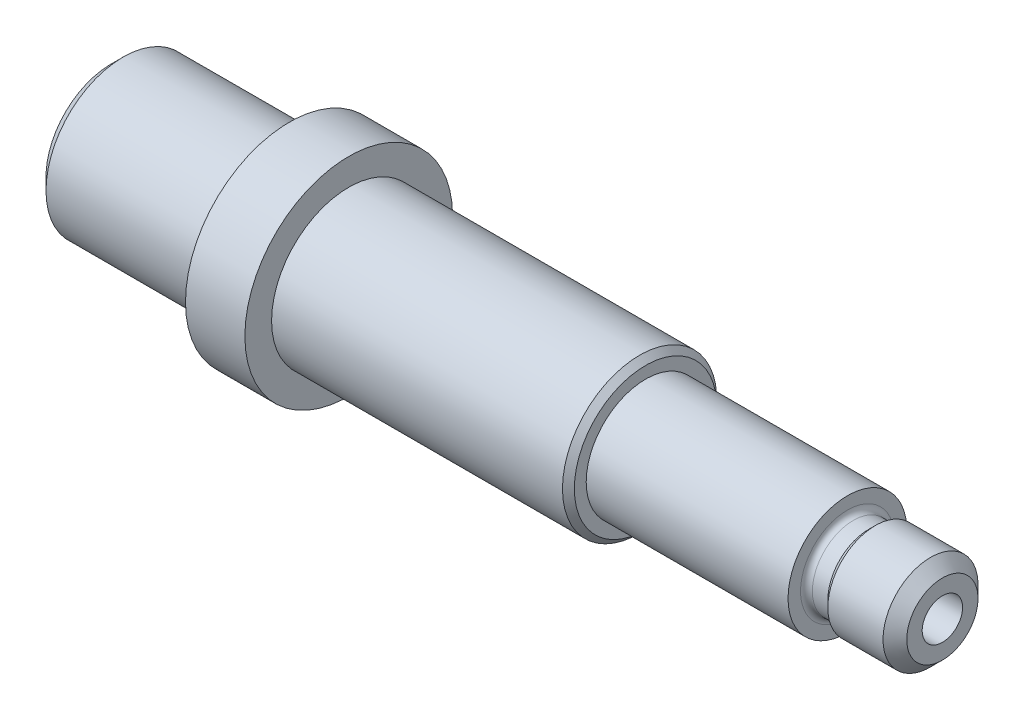
ISO-10303-21;
HEADER;
FILE_DESCRIPTION(('STEP AP214'),'2;1');
FILE_NAME('part.step','',(''),(''),'','','');
FILE_SCHEMA(('AUTOMOTIVE_DESIGN { 1 0 10303 214 1 1 1 1 }'));
ENDSEC;
DATA;
#1=APPLICATION_CONTEXT('core data for automotive mechanical design processes');
#2=APPLICATION_PROTOCOL_DEFINITION('international standard','automotive_design',2000,#1);
#3=PRODUCT_CONTEXT('',#1,'mechanical');
#4=PRODUCT('Part','Part','',(#3));
#5=PRODUCT_RELATED_PRODUCT_CATEGORY('part','',(#4));
#6=PRODUCT_DEFINITION_FORMATION('','',#4);
#7=PRODUCT_DEFINITION_CONTEXT('part definition',#1,'design');
#8=PRODUCT_DEFINITION('design','',#6,#7);
#9=PRODUCT_DEFINITION_SHAPE('','',#8);
#10=(LENGTH_UNIT() NAMED_UNIT(*) SI_UNIT(.MILLI.,.METRE.));
#11=(NAMED_UNIT(*) PLANE_ANGLE_UNIT() SI_UNIT($,.RADIAN.));
#12=(NAMED_UNIT(*) SI_UNIT($,.STERADIAN.) SOLID_ANGLE_UNIT());
#13=UNCERTAINTY_MEASURE_WITH_UNIT(LENGTH_MEASURE(1.E-05),#10,'distance_accuracy_value','');
#14=(GEOMETRIC_REPRESENTATION_CONTEXT(3) GLOBAL_UNCERTAINTY_ASSIGNED_CONTEXT((#13)) GLOBAL_UNIT_ASSIGNED_CONTEXT((#10,
#11,#12)) REPRESENTATION_CONTEXT('',''));
#15=CARTESIAN_POINT('',(0.,0.,0.));
#16=DIRECTION('',(0.,0.,1.));
#17=DIRECTION('',(1.,0.,0.));
#18=AXIS2_PLACEMENT_3D('',#15,#16,#17);
#19=CARTESIAN_POINT('',(0.,0.,0.));
#20=DIRECTION('',(1.,0.,0.));
#21=DIRECTION('',(0.,0.,-1.));
#22=AXIS2_PLACEMENT_3D('',#19,#20,#21);
#23=PLANE('',#22);
#24=CARTESIAN_POINT('',(0.,0.,0.));
#25=DIRECTION('',(1.,0.,0.));
#26=DIRECTION('',(0.,0.,-1.));
#27=AXIS2_PLACEMENT_3D('',#24,#25,#26);
#28=CIRCLE('',#27,11.);
#29=CARTESIAN_POINT('',(0.,0.,-11.));
#30=VERTEX_POINT('',#29);
#31=EDGE_CURVE('E111',#30,#30,#28,.F.);
#32=ORIENTED_EDGE('',*,*,#31,.T.);
#33=EDGE_LOOP('',(#32));
#34=FACE_BOUND('',#33,.T.);
#35=CARTESIAN_POINT('',(0.,0.,0.));
#36=DIRECTION('',(-1.,0.,0.));
#37=DIRECTION('',(0.,0.,1.));
#38=AXIS2_PLACEMENT_3D('',#35,#36,#37);
#39=CIRCLE('',#38,5.5);
#40=CARTESIAN_POINT('',(0.,0.,5.5));
#41=VERTEX_POINT('',#40);
#42=EDGE_CURVE('E79',#41,#41,#39,.T.);
#43=ORIENTED_EDGE('',*,*,#42,.F.);
#44=EDGE_LOOP('',(#43));
#45=FACE_BOUND('',#44,.T.);
#46=ADVANCED_FACE('F55',(#34,#45),#23,.F.);
#47=CARTESIAN_POINT('',(-123.335902370818,0.,0.));
#48=DIRECTION('',(-1.,0.,0.));
#49=DIRECTION('',(0.,0.,1.));
#50=AXIS2_PLACEMENT_3D('',#47,#48,#49);
#51=CYLINDRICAL_SURFACE('',#50,13.);
#52=CARTESIAN_POINT('',(2.,0.,0.));
#53=DIRECTION('',(1.,0.,0.));
#54=DIRECTION('',(0.,0.,-1.));
#55=AXIS2_PLACEMENT_3D('',#52,#53,#54);
#56=CIRCLE('',#55,13.);
#57=CARTESIAN_POINT('',(2.,0.,-13.));
#58=VERTEX_POINT('',#57);
#59=EDGE_CURVE('E114',#58,#58,#56,.T.);
#60=ORIENTED_EDGE('',*,*,#59,.T.);
#61=EDGE_LOOP('',(#60));
#62=FACE_BOUND('',#61,.T.);
#63=CARTESIAN_POINT('',(30.,0.,0.));
#64=DIRECTION('',(-1.,0.,0.));
#65=DIRECTION('',(0.,0.,1.));
#66=AXIS2_PLACEMENT_3D('',#63,#64,#65);
#67=CIRCLE('',#66,13.);
#68=CARTESIAN_POINT('',(30.,0.,13.));
#69=VERTEX_POINT('',#68);
#70=EDGE_CURVE('E108',#69,#69,#67,.T.);
#71=ORIENTED_EDGE('',*,*,#70,.T.);
#72=EDGE_LOOP('',(#71));
#73=FACE_BOUND('',#72,.T.);
#74=ADVANCED_FACE('F151',(#62,#73),#51,.T.);
#75=CARTESIAN_POINT('',(30.,13.,0.));
#76=DIRECTION('',(1.,0.,0.));
#77=DIRECTION('',(0.,0.,-1.));
#78=AXIS2_PLACEMENT_3D('',#75,#76,#77);
#79=PLANE('',#78);
#80=ORIENTED_EDGE('',*,*,#70,.F.);
#81=EDGE_LOOP('',(#80));
#82=FACE_BOUND('',#81,.T.);
#83=CARTESIAN_POINT('',(30.,0.,0.));
#84=DIRECTION('',(-1.,0.,0.));
#85=DIRECTION('',(0.,0.,1.));
#86=AXIS2_PLACEMENT_3D('',#83,#84,#85);
#87=CIRCLE('',#86,17.5);
#88=CARTESIAN_POINT('',(30.,0.,17.5));
#89=VERTEX_POINT('',#88);
#90=EDGE_CURVE('E105',#89,#89,#87,.T.);
#91=ORIENTED_EDGE('',*,*,#90,.T.);
#92=EDGE_LOOP('',(#91));
#93=FACE_BOUND('',#92,.T.);
#94=ADVANCED_FACE('F158',(#82,#93),#79,.F.);
#95=CARTESIAN_POINT('',(-123.335902370818,0.,0.));
#96=DIRECTION('',(-1.,0.,0.));
#97=DIRECTION('',(0.,0.,1.));
#98=AXIS2_PLACEMENT_3D('',#95,#96,#97);
#99=CYLINDRICAL_SURFACE('',#98,17.5);
#100=ORIENTED_EDGE('',*,*,#90,.F.);
#101=EDGE_LOOP('',(#100));
#102=FACE_BOUND('',#101,.T.);
#103=CARTESIAN_POINT('',(40.,0.,0.));
#104=DIRECTION('',(-1.,0.,0.));
#105=DIRECTION('',(0.,0.,1.));
#106=AXIS2_PLACEMENT_3D('',#103,#104,#105);
#107=CIRCLE('',#106,17.5);
#108=CARTESIAN_POINT('',(40.,0.,17.5));
#109=VERTEX_POINT('',#108);
#110=EDGE_CURVE('E102',#109,#109,#107,.T.);
#111=ORIENTED_EDGE('',*,*,#110,.T.);
#112=EDGE_LOOP('',(#111));
#113=FACE_BOUND('',#112,.T.);
#114=ADVANCED_FACE('F204',(#102,#113),#99,.T.);
#115=CARTESIAN_POINT('',(40.,17.5,0.));
#116=DIRECTION('',(-1.,0.,0.));
#117=DIRECTION('',(0.,0.,1.));
#118=AXIS2_PLACEMENT_3D('',#115,#116,#117);
#119=PLANE('',#118);
#120=ORIENTED_EDGE('',*,*,#110,.F.);
#121=EDGE_LOOP('',(#120));
#122=FACE_BOUND('',#121,.T.);
#123=CARTESIAN_POINT('',(40.,0.,0.));
#124=DIRECTION('',(-1.,0.,0.));
#125=DIRECTION('',(0.,0.,1.));
#126=AXIS2_PLACEMENT_3D('',#123,#124,#125);
#127=CIRCLE('',#126,13.);
#128=CARTESIAN_POINT('',(40.,0.,13.));
#129=VERTEX_POINT('',#128);
#130=EDGE_CURVE('E99',#129,#129,#127,.T.);
#131=ORIENTED_EDGE('',*,*,#130,.T.);
#132=EDGE_LOOP('',(#131));
#133=FACE_BOUND('',#132,.T.);
#134=ADVANCED_FACE('F199',(#122,#133),#119,.F.);
#135=CARTESIAN_POINT('',(-123.335902370818,0.,0.));
#136=DIRECTION('',(-1.,0.,0.));
#137=DIRECTION('',(0.,0.,1.));
#138=AXIS2_PLACEMENT_3D('',#135,#136,#137);
#139=CYLINDRICAL_SURFACE('',#138,13.);
#140=CARTESIAN_POINT('',(89.,0.,0.));
#141=DIRECTION('',(-1.,0.,0.));
#142=DIRECTION('',(0.,0.,1.));
#143=AXIS2_PLACEMENT_3D('',#140,#141,#142);
#144=CIRCLE('',#143,13.);
#145=CARTESIAN_POINT('',(89.,0.,13.));
#146=VERTEX_POINT('',#145);
#147=EDGE_CURVE('E123',#146,#146,#144,.T.);
#148=ORIENTED_EDGE('',*,*,#147,.T.);
#149=EDGE_LOOP('',(#148));
#150=FACE_BOUND('',#149,.T.);
#151=ORIENTED_EDGE('',*,*,#130,.F.);
#152=EDGE_LOOP('',(#151));
#153=FACE_BOUND('',#152,.T.);
#154=ADVANCED_FACE('F195',(#150,#153),#139,.T.);
#155=CARTESIAN_POINT('',(90.,10.,0.));
#156=DIRECTION('',(-1.,0.,0.));
#157=DIRECTION('',(0.,0.,1.));
#158=AXIS2_PLACEMENT_3D('',#155,#156,#157);
#159=PLANE('',#158);
#160=CARTESIAN_POINT('',(90.,0.,0.));
#161=DIRECTION('',(-1.,0.,0.));
#162=DIRECTION('',(0.,0.,1.));
#163=AXIS2_PLACEMENT_3D('',#160,#161,#162);
#164=CIRCLE('',#163,12.);
#165=CARTESIAN_POINT('',(90.,0.,12.));
#166=VERTEX_POINT('',#165);
#167=EDGE_CURVE('E126',#166,#166,#164,.F.);
#168=ORIENTED_EDGE('',*,*,#167,.T.);
#169=EDGE_LOOP('',(#168));
#170=FACE_BOUND('',#169,.T.);
#171=CARTESIAN_POINT('',(90.,0.,0.));
#172=DIRECTION('',(-1.,0.,0.));
#173=DIRECTION('',(0.,0.,1.));
#174=AXIS2_PLACEMENT_3D('',#171,#172,#173);
#175=CIRCLE('',#174,10.);
#176=CARTESIAN_POINT('',(90.,0.,10.));
#177=VERTEX_POINT('',#176);
#178=EDGE_CURVE('E96',#177,#177,#175,.T.);
#179=ORIENTED_EDGE('',*,*,#178,.T.);
#180=EDGE_LOOP('',(#179));
#181=FACE_BOUND('',#180,.T.);
#182=ADVANCED_FACE('F198',(#170,#181),#159,.F.);
#183=CARTESIAN_POINT('',(-123.335902370818,0.,0.));
#184=DIRECTION('',(-1.,0.,0.));
#185=DIRECTION('',(0.,0.,1.));
#186=AXIS2_PLACEMENT_3D('',#183,#184,#185);
#187=CYLINDRICAL_SURFACE('',#186,10.);
#188=ORIENTED_EDGE('',*,*,#178,.F.);
#189=EDGE_LOOP('',(#188));
#190=FACE_BOUND('',#189,.T.);
#191=CARTESIAN_POINT('',(124.,0.,0.));
#192=DIRECTION('',(-1.,0.,0.));
#193=DIRECTION('',(0.,0.,1.));
#194=AXIS2_PLACEMENT_3D('',#191,#192,#193);
#195=CIRCLE('',#194,10.);
#196=CARTESIAN_POINT('',(124.,0.,10.));
#197=VERTEX_POINT('',#196);
#198=EDGE_CURVE('E93',#197,#197,#195,.T.);
#199=ORIENTED_EDGE('',*,*,#198,.T.);
#200=EDGE_LOOP('',(#199));
#201=FACE_BOUND('',#200,.T.);
#202=ADVANCED_FACE('F249',(#190,#201),#187,.T.);
#203=CARTESIAN_POINT('',(124.,10.,0.));
#204=DIRECTION('',(-1.,0.,0.));
#205=DIRECTION('',(0.,0.,1.));
#206=AXIS2_PLACEMENT_3D('',#203,#204,#205);
#207=PLANE('',#206);
#208=CARTESIAN_POINT('',(124.,0.,0.));
#209=DIRECTION('',(-1.,0.,0.));
#210=DIRECTION('',(0.,0.,1.));
#211=AXIS2_PLACEMENT_3D('',#208,#209,#210);
#212=CIRCLE('',#211,7.9);
#213=CARTESIAN_POINT('',(124.,0.,7.9));
#214=VERTEX_POINT('',#213);
#215=EDGE_CURVE('E63',#214,#214,#212,.T.);
#216=ORIENTED_EDGE('',*,*,#215,.T.);
#217=EDGE_LOOP('',(#216));
#218=FACE_BOUND('',#217,.T.);
#219=ORIENTED_EDGE('',*,*,#198,.F.);
#220=EDGE_LOOP('',(#219));
#221=FACE_BOUND('',#220,.T.);
#222=ADVANCED_FACE('F137',(#218,#221),#207,.F.);
#223=CARTESIAN_POINT('',(37.5,0.,0.));
#224=DIRECTION('',(-1.,0.,0.));
#225=DIRECTION('',(0.,0.,1.));
#226=AXIS2_PLACEMENT_3D('',#223,#224,#225);
#227=CONICAL_SURFACE('',#226,4.24999999999999,1.02974425867665);
#228=CARTESIAN_POINT('',(40.0536576308671,0.,0.));
#229=VERTEX_POINT('',#228);
#230=VERTEX_LOOP('',#229);
#231=FACE_BOUND('',#230,.T.);
#232=CARTESIAN_POINT('',(37.5,0.,0.));
#233=DIRECTION('',(-1.,0.,0.));
#234=DIRECTION('',(0.,0.,1.));
#235=AXIS2_PLACEMENT_3D('',#232,#233,#234);
#236=CIRCLE('',#235,4.24999999999999);
#237=CARTESIAN_POINT('',(37.5,0.,4.24999999999999));
#238=VERTEX_POINT('',#237);
#239=EDGE_CURVE('E90',#238,#238,#236,.T.);
#240=ORIENTED_EDGE('',*,*,#239,.T.);
#241=EDGE_LOOP('',(#240));
#242=FACE_BOUND('',#241,.T.);
#243=ADVANCED_FACE('F268',(#231,#242),#227,.F.);
#244=CARTESIAN_POINT('',(0.,0.,0.));
#245=DIRECTION('',(-1.,0.,0.));
#246=DIRECTION('',(0.,0.,1.));
#247=AXIS2_PLACEMENT_3D('',#244,#245,#246);
#248=CYLINDRICAL_SURFACE('',#247,4.24999999999999);
#249=ORIENTED_EDGE('',*,*,#239,.F.);
#250=EDGE_LOOP('',(#249));
#251=FACE_BOUND('',#250,.T.);
#252=CARTESIAN_POINT('',(1.25000000000002,0.,0.));
#253=DIRECTION('',(-1.,0.,0.));
#254=DIRECTION('',(0.,0.,1.));
#255=AXIS2_PLACEMENT_3D('',#252,#253,#254);
#256=CIRCLE('',#255,4.24999999999999);
#257=CARTESIAN_POINT('',(1.25000000000002,0.,4.24999999999999));
#258=VERTEX_POINT('',#257);
#259=EDGE_CURVE('E83',#258,#258,#256,.T.);
#260=ORIENTED_EDGE('',*,*,#259,.T.);
#261=EDGE_LOOP('',(#260));
#262=FACE_BOUND('',#261,.T.);
#263=ADVANCED_FACE('F292',(#251,#262),#248,.F.);
#264=CARTESIAN_POINT('',(0.,0.,0.));
#265=DIRECTION('',(-1.,0.,0.));
#266=DIRECTION('',(0.,0.,1.));
#267=AXIS2_PLACEMENT_3D('',#264,#265,#266);
#268=CONICAL_SURFACE('',#267,5.5,0.785398163397447);
#269=ORIENTED_EDGE('',*,*,#259,.F.);
#270=EDGE_LOOP('',(#269));
#271=FACE_BOUND('',#270,.T.);
#272=ORIENTED_EDGE('',*,*,#42,.T.);
#273=EDGE_LOOP('',(#272));
#274=FACE_BOUND('',#273,.T.);
#275=ADVANCED_FACE('F302',(#271,#274),#268,.F.);
#276=CARTESIAN_POINT('',(0.,0.,0.));
#277=DIRECTION('',(-1.,0.,0.));
#278=DIRECTION('',(0.,0.,1.));
#279=AXIS2_PLACEMENT_3D('',#276,#277,#278);
#280=CYLINDRICAL_SURFACE('',#279,6.9);
#281=CARTESIAN_POINT('',(125.,0.,0.));
#282=DIRECTION('',(-1.,0.,0.));
#283=DIRECTION('',(0.,0.,1.));
#284=AXIS2_PLACEMENT_3D('',#281,#282,#283);
#285=CIRCLE('',#284,6.9);
#286=CARTESIAN_POINT('',(125.,0.,6.9));
#287=VERTEX_POINT('',#286);
#288=EDGE_CURVE('E12',#287,#287,#285,.F.);
#289=ORIENTED_EDGE('',*,*,#288,.T.);
#290=EDGE_LOOP('',(#289));
#291=FACE_BOUND('',#290,.T.);
#292=CARTESIAN_POINT('',(127.6,0.,0.));
#293=DIRECTION('',(1.,0.,0.));
#294=DIRECTION('',(0.,0.,-1.));
#295=AXIS2_PLACEMENT_3D('',#292,#293,#294);
#296=CIRCLE('',#295,6.9);
#297=CARTESIAN_POINT('',(127.6,0.,-6.9));
#298=VERTEX_POINT('',#297);
#299=EDGE_CURVE('E132',#298,#298,#296,.F.);
#300=ORIENTED_EDGE('',*,*,#299,.T.);
#301=EDGE_LOOP('',(#300));
#302=FACE_BOUND('',#301,.T.);
#303=ADVANCED_FACE('F73',(#291,#302),#280,.T.);
#304=CARTESIAN_POINT('',(110.,0.,0.));
#305=DIRECTION('',(1.,0.,0.));
#306=DIRECTION('',(0.,0.,-1.));
#307=AXIS2_PLACEMENT_3D('',#304,#305,#306);
#308=CONICAL_SURFACE('',#307,3.39999999999999,1.02974425867665);
#309=CARTESIAN_POINT('',(107.957073895306,0.,0.));
#310=VERTEX_POINT('',#309);
#311=VERTEX_LOOP('',#310);
#312=FACE_BOUND('',#311,.T.);
#313=CARTESIAN_POINT('',(110.,0.,0.));
#314=DIRECTION('',(1.,0.,0.));
#315=DIRECTION('',(0.,0.,-1.));
#316=AXIS2_PLACEMENT_3D('',#313,#314,#315);
#317=CIRCLE('',#316,3.39999999999999);
#318=CARTESIAN_POINT('',(110.,0.,-3.39999999999999));
#319=VERTEX_POINT('',#318);
#320=EDGE_CURVE('E77',#319,#319,#317,.T.);
#321=ORIENTED_EDGE('',*,*,#320,.T.);
#322=EDGE_LOOP('',(#321));
#323=FACE_BOUND('',#322,.T.);
#324=ADVANCED_FACE('F69',(#312,#323),#308,.F.);
#325=CARTESIAN_POINT('',(140.,0.,0.));
#326=DIRECTION('',(1.,0.,0.));
#327=DIRECTION('',(0.,0.,-1.));
#328=AXIS2_PLACEMENT_3D('',#325,#326,#327);
#329=CYLINDRICAL_SURFACE('',#328,3.4);
#330=ORIENTED_EDGE('',*,*,#320,.F.);
#331=EDGE_LOOP('',(#330));
#332=FACE_BOUND('',#331,.T.);
#333=CARTESIAN_POINT('',(140.,0.,0.));
#334=DIRECTION('',(1.,0.,0.));
#335=DIRECTION('',(0.,0.,-1.));
#336=AXIS2_PLACEMENT_3D('',#333,#334,#335);
#337=CIRCLE('',#336,3.4);
#338=CARTESIAN_POINT('',(140.,0.,-3.4));
#339=VERTEX_POINT('',#338);
#340=EDGE_CURVE('E80',#339,#339,#337,.T.);
#341=ORIENTED_EDGE('',*,*,#340,.T.);
#342=EDGE_LOOP('',(#341));
#343=FACE_BOUND('',#342,.T.);
#344=ADVANCED_FACE('F72',(#332,#343),#329,.F.);
#345=CARTESIAN_POINT('',(140.,8.,0.));
#346=DIRECTION('',(-1.,0.,0.));
#347=DIRECTION('',(0.,0.,1.));
#348=AXIS2_PLACEMENT_3D('',#345,#346,#347);
#349=PLANE('',#348);
#350=CARTESIAN_POINT('',(140.,0.,0.));
#351=DIRECTION('',(-1.,0.,0.));
#352=DIRECTION('',(0.,0.,1.));
#353=AXIS2_PLACEMENT_3D('',#350,#351,#352);
#354=CIRCLE('',#353,5.99999999999999);
#355=CARTESIAN_POINT('',(140.,0.,5.99999999999999));
#356=VERTEX_POINT('',#355);
#357=EDGE_CURVE('E120',#356,#356,#354,.F.);
#358=ORIENTED_EDGE('',*,*,#357,.T.);
#359=EDGE_LOOP('',(#358));
#360=FACE_BOUND('',#359,.T.);
#361=ORIENTED_EDGE('',*,*,#340,.F.);
#362=EDGE_LOOP('',(#361));
#363=FACE_BOUND('',#362,.T.);
#364=ADVANCED_FACE('F276',(#360,#363),#349,.F.);
#365=CARTESIAN_POINT('',(-123.335902370818,0.,0.));
#366=DIRECTION('',(-1.,0.,0.));
#367=DIRECTION('',(0.,0.,1.));
#368=AXIS2_PLACEMENT_3D('',#365,#366,#367);
#369=CYLINDRICAL_SURFACE('',#368,8.);
#370=CARTESIAN_POINT('',(128.7,0.,0.));
#371=DIRECTION('',(-1.,0.,0.));
#372=DIRECTION('',(0.,0.,1.));
#373=AXIS2_PLACEMENT_3D('',#370,#371,#372);
#374=CIRCLE('',#373,8.);
#375=CARTESIAN_POINT('',(128.7,0.,8.));
#376=VERTEX_POINT('',#375);
#377=EDGE_CURVE('E129',#376,#376,#374,.F.);
#378=ORIENTED_EDGE('',*,*,#377,.T.);
#379=EDGE_LOOP('',(#378));
#380=FACE_BOUND('',#379,.T.);
#381=CARTESIAN_POINT('',(138.,0.,0.));
#382=DIRECTION('',(-1.,0.,0.));
#383=DIRECTION('',(0.,0.,1.));
#384=AXIS2_PLACEMENT_3D('',#381,#382,#383);
#385=CIRCLE('',#384,8.);
#386=CARTESIAN_POINT('',(138.,0.,8.));
#387=VERTEX_POINT('',#386);
#388=EDGE_CURVE('E117',#387,#387,#385,.T.);
#389=ORIENTED_EDGE('',*,*,#388,.T.);
#390=EDGE_LOOP('',(#389));
#391=FACE_BOUND('',#390,.T.);
#392=ADVANCED_FACE('F172',(#380,#391),#369,.T.);
#393=CARTESIAN_POINT('',(0.,0.,0.));
#394=DIRECTION('',(1.,0.,0.));
#395=DIRECTION('',(0.,0.,-1.));
#396=AXIS2_PLACEMENT_3D('',#393,#394,#395);
#397=CONICAL_SURFACE('',#396,11.,0.785398163397447);
#398=ORIENTED_EDGE('',*,*,#59,.F.);
#399=EDGE_LOOP('',(#398));
#400=FACE_BOUND('',#399,.T.);
#401=ORIENTED_EDGE('',*,*,#31,.F.);
#402=EDGE_LOOP('',(#401));
#403=FACE_BOUND('',#402,.T.);
#404=ADVANCED_FACE('F165',(#400,#403),#397,.T.);
#405=CARTESIAN_POINT('',(138.,0.,0.));
#406=DIRECTION('',(-1.,0.,0.));
#407=DIRECTION('',(0.,0.,1.));
#408=AXIS2_PLACEMENT_3D('',#405,#406,#407);
#409=CONICAL_SURFACE('',#408,8.,0.785398163397436);
#410=ORIENTED_EDGE('',*,*,#357,.F.);
#411=EDGE_LOOP('',(#410));
#412=FACE_BOUND('',#411,.T.);
#413=ORIENTED_EDGE('',*,*,#388,.F.);
#414=EDGE_LOOP('',(#413));
#415=FACE_BOUND('',#414,.T.);
#416=ADVANCED_FACE('F171',(#412,#415),#409,.T.);
#417=CARTESIAN_POINT('',(89.,0.,0.));
#418=DIRECTION('',(-1.,0.,0.));
#419=DIRECTION('',(0.,0.,1.));
#420=AXIS2_PLACEMENT_3D('',#417,#418,#419);
#421=CONICAL_SURFACE('',#420,13.,0.785398163397447);
#422=ORIENTED_EDGE('',*,*,#167,.F.);
#423=EDGE_LOOP('',(#422));
#424=FACE_BOUND('',#423,.T.);
#425=ORIENTED_EDGE('',*,*,#147,.F.);
#426=EDGE_LOOP('',(#425));
#427=FACE_BOUND('',#426,.T.);
#428=ADVANCED_FACE('F147',(#424,#427),#421,.T.);
#429=CARTESIAN_POINT('',(126.5,0.,0.));
#430=DIRECTION('',(1.,0.,0.));
#431=DIRECTION('',(0.,0.,-1.));
#432=AXIS2_PLACEMENT_3D('',#429,#430,#431);
#433=CONICAL_SURFACE('',#432,5.79999999999996,0.785398163397462);
#434=ORIENTED_EDGE('',*,*,#377,.F.);
#435=EDGE_LOOP('',(#434));
#436=FACE_BOUND('',#435,.T.);
#437=ORIENTED_EDGE('',*,*,#299,.F.);
#438=EDGE_LOOP('',(#437));
#439=FACE_BOUND('',#438,.T.);
#440=ADVANCED_FACE('F141',(#436,#439),#433,.T.);
#441=CARTESIAN_POINT('',(125.,0.,0.));
#442=DIRECTION('',(-1.,0.,0.));
#443=DIRECTION('',(0.,0.,1.));
#444=AXIS2_PLACEMENT_3D('',#441,#442,#443);
#445=TOROIDAL_SURFACE('',#444,7.9,1.);
#446=ORIENTED_EDGE('',*,*,#288,.F.);
#447=EDGE_LOOP('',(#446));
#448=FACE_BOUND('',#447,.T.);
#449=ORIENTED_EDGE('',*,*,#215,.F.);
#450=EDGE_LOOP('',(#449));
#451=FACE_BOUND('',#450,.T.);
#452=ADVANCED_FACE('F57',(#448,#451),#445,.F.);
#453=CLOSED_SHELL('',(#46,#74,#94,#114,#134,#154,#182,#202,#222,#243,#263,#275,#303,#324,#344,
#364,#392,#404,#416,#428,#440,#452));
#454=MANIFOLD_SOLID_BREP('B2',#453);
#455=ADVANCED_BREP_SHAPE_REPRESENTATION('',(#18,#454),#14);
#456=SHAPE_DEFINITION_REPRESENTATION(#9,#455);
ENDSEC;
END-ISO-10303-21;
